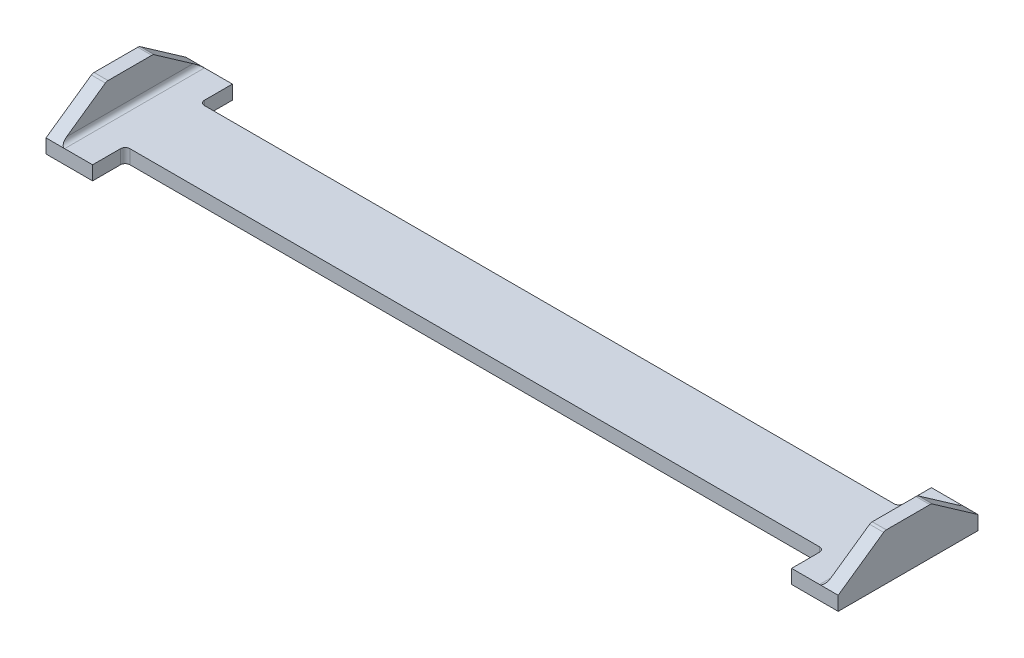
ISO-10303-21;
HEADER;
FILE_DESCRIPTION(('STEP AP214'),'2;1');
FILE_NAME('part.step','',(''),(''),'','','');
FILE_SCHEMA(('AUTOMOTIVE_DESIGN { 1 0 10303 214 1 1 1 1 }'));
ENDSEC;
DATA;
#1=APPLICATION_CONTEXT('core data for automotive mechanical design processes');
#2=APPLICATION_PROTOCOL_DEFINITION('international standard','automotive_design',2000,#1);
#3=PRODUCT_CONTEXT('',#1,'mechanical');
#4=PRODUCT('Part','Part','',(#3));
#5=PRODUCT_RELATED_PRODUCT_CATEGORY('part','',(#4));
#6=PRODUCT_DEFINITION_FORMATION('','',#4);
#7=PRODUCT_DEFINITION_CONTEXT('part definition',#1,'design');
#8=PRODUCT_DEFINITION('design','',#6,#7);
#9=PRODUCT_DEFINITION_SHAPE('','',#8);
#10=(LENGTH_UNIT() NAMED_UNIT(*) SI_UNIT(.MILLI.,.METRE.));
#11=(NAMED_UNIT(*) PLANE_ANGLE_UNIT() SI_UNIT($,.RADIAN.));
#12=(NAMED_UNIT(*) SI_UNIT($,.STERADIAN.) SOLID_ANGLE_UNIT());
#13=UNCERTAINTY_MEASURE_WITH_UNIT(LENGTH_MEASURE(1.E-05),#10,'distance_accuracy_value','');
#14=(GEOMETRIC_REPRESENTATION_CONTEXT(3) GLOBAL_UNCERTAINTY_ASSIGNED_CONTEXT((#13)) GLOBAL_UNIT_ASSIGNED_CONTEXT((#10,
#11,#12)) REPRESENTATION_CONTEXT('',''));
#15=CARTESIAN_POINT('',(0.,0.,0.));
#16=DIRECTION('',(0.,0.,1.));
#17=DIRECTION('',(1.,0.,0.));
#18=AXIS2_PLACEMENT_3D('',#15,#16,#17);
#19=CARTESIAN_POINT('',(0.,3.81,0.));
#20=DIRECTION('',(0.,1.,0.));
#21=DIRECTION('',(0.,0.,1.));
#22=AXIS2_PLACEMENT_3D('',#19,#20,#21);
#23=PLANE('',#22);
#24=DIRECTION('',(1.,0.,0.));
#25=VECTOR('',#24,1.);
#26=CARTESIAN_POINT('',(95.25,3.81,19.05));
#27=LINE('',#26,#25);
#28=CARTESIAN_POINT('',(95.25,3.81,19.05));
#29=VERTEX_POINT('',#28);
#30=CARTESIAN_POINT('',(102.87,3.81,19.05));
#31=VERTEX_POINT('',#30);
#32=EDGE_CURVE('E301',#29,#31,#27,.T.);
#33=ORIENTED_EDGE('',*,*,#32,.T.);
#34=DIRECTION('',(0.,0.,-1.));
#35=VECTOR('',#34,1.);
#36=CARTESIAN_POINT('',(102.87,3.81,0.));
#37=LINE('',#36,#35);
#38=CARTESIAN_POINT('',(102.87,3.81,-19.05));
#39=VERTEX_POINT('',#38);
#40=EDGE_CURVE('E438',#31,#39,#37,.T.);
#41=ORIENTED_EDGE('',*,*,#40,.T.);
#42=DIRECTION('',(-1.,0.,0.));
#43=VECTOR('',#42,1.);
#44=CARTESIAN_POINT('',(95.25,3.81,-19.05));
#45=LINE('',#44,#43);
#46=CARTESIAN_POINT('',(95.25,3.81,-19.05));
#47=VERTEX_POINT('',#46);
#48=EDGE_CURVE('E305',#39,#47,#45,.T.);
#49=ORIENTED_EDGE('',*,*,#48,.T.);
#50=DIRECTION('',(0.,0.,1.));
#51=VECTOR('',#50,1.);
#52=CARTESIAN_POINT('',(95.25,3.81,-10.16));
#53=LINE('',#52,#51);
#54=CARTESIAN_POINT('',(95.25,3.81,-11.43));
#55=VERTEX_POINT('',#54);
#56=EDGE_CURVE('E309',#47,#55,#53,.T.);
#57=ORIENTED_EDGE('',*,*,#56,.T.);
#58=CARTESIAN_POINT('',(93.98,3.81,-11.43));
#59=DIRECTION('',(0.,1.,0.));
#60=DIRECTION('',(0.,0.,1.));
#61=AXIS2_PLACEMENT_3D('',#58,#59,#60);
#62=CIRCLE('',#61,1.27);
#63=CARTESIAN_POINT('',(93.98,3.81,-10.16));
#64=VERTEX_POINT('',#63);
#65=EDGE_CURVE('E486',#55,#64,#62,.F.);
#66=ORIENTED_EDGE('',*,*,#65,.T.);
#67=DIRECTION('',(-1.,0.,0.));
#68=VECTOR('',#67,1.);
#69=CARTESIAN_POINT('',(95.25,3.81,-10.16));
#70=LINE('',#69,#68);
#71=CARTESIAN_POINT('',(-93.98,3.81,-10.16));
#72=VERTEX_POINT('',#71);
#73=EDGE_CURVE('E313',#64,#72,#70,.T.);
#74=ORIENTED_EDGE('',*,*,#73,.T.);
#75=CARTESIAN_POINT('',(-93.98,3.81,-11.43));
#76=DIRECTION('',(0.,1.,0.));
#77=DIRECTION('',(0.,0.,1.));
#78=AXIS2_PLACEMENT_3D('',#75,#76,#77);
#79=CIRCLE('',#78,1.27);
#80=CARTESIAN_POINT('',(-95.25,3.81,-11.43));
#81=VERTEX_POINT('',#80);
#82=EDGE_CURVE('E498',#72,#81,#79,.F.);
#83=ORIENTED_EDGE('',*,*,#82,.T.);
#84=DIRECTION('',(0.,0.,-1.));
#85=VECTOR('',#84,1.);
#86=CARTESIAN_POINT('',(-95.25,3.81,-10.16));
#87=LINE('',#86,#85);
#88=CARTESIAN_POINT('',(-95.25,3.81,-19.05));
#89=VERTEX_POINT('',#88);
#90=EDGE_CURVE('E284',#81,#89,#87,.T.);
#91=ORIENTED_EDGE('',*,*,#90,.T.);
#92=DIRECTION('',(-1.,0.,0.));
#93=VECTOR('',#92,1.);
#94=CARTESIAN_POINT('',(-95.25,3.81,-19.05));
#95=LINE('',#94,#93);
#96=CARTESIAN_POINT('',(-102.87,3.81,-19.05));
#97=VERTEX_POINT('',#96);
#98=EDGE_CURVE('E287',#89,#97,#95,.T.);
#99=ORIENTED_EDGE('',*,*,#98,.T.);
#100=DIRECTION('',(0.,0.,1.));
#101=VECTOR('',#100,1.);
#102=CARTESIAN_POINT('',(-102.87,3.81,0.));
#103=LINE('',#102,#101);
#104=CARTESIAN_POINT('',(-102.87,3.81,19.05));
#105=VERTEX_POINT('',#104);
#106=EDGE_CURVE('E434',#97,#105,#103,.T.);
#107=ORIENTED_EDGE('',*,*,#106,.T.);
#108=DIRECTION('',(1.,0.,0.));
#109=VECTOR('',#108,1.);
#110=CARTESIAN_POINT('',(-95.25,3.81,19.05));
#111=LINE('',#110,#109);
#112=CARTESIAN_POINT('',(-95.25,3.81,19.05));
#113=VERTEX_POINT('',#112);
#114=EDGE_CURVE('E237',#105,#113,#111,.T.);
#115=ORIENTED_EDGE('',*,*,#114,.T.);
#116=DIRECTION('',(0.,0.,-1.));
#117=VECTOR('',#116,1.);
#118=CARTESIAN_POINT('',(-95.25,3.81,10.16));
#119=LINE('',#118,#117);
#120=CARTESIAN_POINT('',(-95.25,3.81,11.43));
#121=VERTEX_POINT('',#120);
#122=EDGE_CURVE('E242',#113,#121,#119,.T.);
#123=ORIENTED_EDGE('',*,*,#122,.T.);
#124=CARTESIAN_POINT('',(-93.98,3.81,11.43));
#125=DIRECTION('',(0.,1.,0.));
#126=DIRECTION('',(0.,0.,1.));
#127=AXIS2_PLACEMENT_3D('',#124,#125,#126);
#128=CIRCLE('',#127,1.27);
#129=CARTESIAN_POINT('',(-93.98,3.81,10.16));
#130=VERTEX_POINT('',#129);
#131=EDGE_CURVE('E11',#121,#130,#128,.F.);
#132=ORIENTED_EDGE('',*,*,#131,.T.);
#133=DIRECTION('',(1.,0.,0.));
#134=VECTOR('',#133,1.);
#135=CARTESIAN_POINT('',(95.25,3.81,10.16));
#136=LINE('',#135,#134);
#137=CARTESIAN_POINT('',(93.98,3.81,10.16));
#138=VERTEX_POINT('',#137);
#139=EDGE_CURVE('E294',#130,#138,#136,.T.);
#140=ORIENTED_EDGE('',*,*,#139,.T.);
#141=CARTESIAN_POINT('',(93.98,3.81,11.43));
#142=DIRECTION('',(0.,1.,0.));
#143=DIRECTION('',(0.,0.,1.));
#144=AXIS2_PLACEMENT_3D('',#141,#142,#143);
#145=CIRCLE('',#144,1.27);
#146=CARTESIAN_POINT('',(95.25,3.81,11.43));
#147=VERTEX_POINT('',#146);
#148=EDGE_CURVE('E492',#138,#147,#145,.F.);
#149=ORIENTED_EDGE('',*,*,#148,.T.);
#150=DIRECTION('',(0.,0.,1.));
#151=VECTOR('',#150,1.);
#152=CARTESIAN_POINT('',(95.25,3.81,10.16));
#153=LINE('',#152,#151);
#154=EDGE_CURVE('E298',#147,#29,#153,.T.);
#155=ORIENTED_EDGE('',*,*,#154,.T.);
#156=EDGE_LOOP('',(#33,#41,#49,#57,#66,#74,#83,#91,#99,#107,#115,#123,#132,#140,#149,#155));
#157=FACE_BOUND('',#156,.T.);
#158=ADVANCED_FACE('F45',(#157),#23,.T.);
#159=CARTESIAN_POINT('',(-95.25,3.81,-10.16));
#160=DIRECTION('',(-1.,0.,0.));
#161=DIRECTION('',(0.,0.,1.));
#162=AXIS2_PLACEMENT_3D('',#159,#160,#161);
#163=PLANE('',#162);
#164=ORIENTED_EDGE('',*,*,#90,.F.);
#165=DIRECTION('',(0.,-1.,0.));
#166=VECTOR('',#165,1.);
#167=CARTESIAN_POINT('',(-95.25,0.,-11.43));
#168=LINE('',#167,#166);
#169=CARTESIAN_POINT('',(-95.25,0.,-11.43));
#170=VERTEX_POINT('',#169);
#171=EDGE_CURVE('E477',#81,#170,#168,.T.);
#172=ORIENTED_EDGE('',*,*,#171,.T.);
#173=DIRECTION('',(0.,0.,-1.));
#174=VECTOR('',#173,1.);
#175=CARTESIAN_POINT('',(-95.25,0.,-10.16));
#176=LINE('',#175,#174);
#177=CARTESIAN_POINT('',(-95.25,0.,-19.05));
#178=VERTEX_POINT('',#177);
#179=EDGE_CURVE('E283',#170,#178,#176,.T.);
#180=ORIENTED_EDGE('',*,*,#179,.T.);
#181=DIRECTION('',(0.,-1.,0.));
#182=VECTOR('',#181,1.);
#183=CARTESIAN_POINT('',(-95.25,3.81,-19.05));
#184=LINE('',#183,#182);
#185=EDGE_CURVE('E374',#89,#178,#184,.T.);
#186=ORIENTED_EDGE('',*,*,#185,.F.);
#187=EDGE_LOOP('',(#164,#172,#180,#186));
#188=FACE_BOUND('',#187,.T.);
#189=ADVANCED_FACE('F604',(#188),#163,.F.);
#190=CARTESIAN_POINT('',(-95.25,3.81,-19.05));
#191=DIRECTION('',(0.,0.,1.));
#192=DIRECTION('',(1.,0.,0.));
#193=AXIS2_PLACEMENT_3D('',#190,#191,#192);
#194=PLANE('',#193);
#195=DIRECTION('',(-1.,0.,0.));
#196=VECTOR('',#195,1.);
#197=CARTESIAN_POINT('',(-104.14,3.81,-19.05));
#198=LINE('',#197,#196);
#199=CARTESIAN_POINT('',(-107.95,3.81,-19.05));
#200=VERTEX_POINT('',#199);
#201=EDGE_CURVE('E279',#97,#200,#198,.T.);
#202=ORIENTED_EDGE('',*,*,#201,.F.);
#203=ORIENTED_EDGE('',*,*,#98,.F.);
#204=ORIENTED_EDGE('',*,*,#185,.T.);
#205=DIRECTION('',(-1.,0.,0.));
#206=VECTOR('',#205,1.);
#207=CARTESIAN_POINT('',(-95.25,0.,-19.05));
#208=LINE('',#207,#206);
#209=CARTESIAN_POINT('',(-107.95,0.,-19.05));
#210=VERTEX_POINT('',#209);
#211=EDGE_CURVE('E320',#178,#210,#208,.T.);
#212=ORIENTED_EDGE('',*,*,#211,.T.);
#213=DIRECTION('',(0.,-1.,0.));
#214=VECTOR('',#213,1.);
#215=CARTESIAN_POINT('',(-107.95,3.81,-19.05));
#216=LINE('',#215,#214);
#217=EDGE_CURVE('E253',#200,#210,#216,.T.);
#218=ORIENTED_EDGE('',*,*,#217,.F.);
#219=EDGE_LOOP('',(#202,#203,#204,#212,#218));
#220=FACE_BOUND('',#219,.T.);
#221=ADVANCED_FACE('F608',(#220),#194,.F.);
#222=CARTESIAN_POINT('',(-107.95,3.81,-19.05));
#223=DIRECTION('',(1.,0.,0.));
#224=DIRECTION('',(0.,0.,-1.));
#225=AXIS2_PLACEMENT_3D('',#222,#223,#224);
#226=PLANE('',#225);
#227=DIRECTION('',(0.,0.,-1.));
#228=VECTOR('',#227,1.);
#229=CARTESIAN_POINT('',(-107.95,12.7,-6.35));
#230=LINE('',#229,#228);
#231=CARTESIAN_POINT('',(-107.95,12.7,5.94966776685974));
#232=VERTEX_POINT('',#231);
#233=CARTESIAN_POINT('',(-107.95,12.7,-5.94966776685974));
#234=VERTEX_POINT('',#233);
#235=EDGE_CURVE('E262',#232,#234,#230,.T.);
#236=ORIENTED_EDGE('',*,*,#235,.T.);
#237=CARTESIAN_POINT('',(-107.95,11.43,-5.94966776685974));
#238=DIRECTION('',(1.,0.,0.));
#239=DIRECTION('',(0.,0.,-1.));
#240=AXIS2_PLACEMENT_3D('',#237,#238,#239);
#241=CIRCLE('',#240,1.27);
#242=CARTESIAN_POINT('',(-107.95,12.4704245390592,-6.67796494420117));
#243=VERTEX_POINT('',#242);
#244=EDGE_CURVE('E417',#234,#243,#241,.F.);
#245=ORIENTED_EDGE('',*,*,#244,.T.);
#246=DIRECTION('',(0.,-0.573462344363328,-0.81923192051904));
#247=VECTOR('',#246,1.);
#248=CARTESIAN_POINT('',(-107.95,3.81,-19.05));
#249=LINE('',#248,#247);
#250=EDGE_CURVE('E267',#243,#200,#249,.T.);
#251=ORIENTED_EDGE('',*,*,#250,.T.);
#252=ORIENTED_EDGE('',*,*,#217,.T.);
#253=DIRECTION('',(0.,0.,1.));
#254=VECTOR('',#253,1.);
#255=CARTESIAN_POINT('',(-107.95,0.,-19.05));
#256=LINE('',#255,#254);
#257=CARTESIAN_POINT('',(-107.95,0.,19.05));
#258=VERTEX_POINT('',#257);
#259=EDGE_CURVE('E251',#210,#258,#256,.T.);
#260=ORIENTED_EDGE('',*,*,#259,.T.);
#261=DIRECTION('',(0.,-1.,0.));
#262=VECTOR('',#261,1.);
#263=CARTESIAN_POINT('',(-107.95,3.81,19.05));
#264=LINE('',#263,#262);
#265=CARTESIAN_POINT('',(-107.95,3.81,19.05));
#266=VERTEX_POINT('',#265);
#267=EDGE_CURVE('E234',#266,#258,#264,.T.);
#268=ORIENTED_EDGE('',*,*,#267,.F.);
#269=DIRECTION('',(0.,0.573462344363328,-0.81923192051904));
#270=VECTOR('',#269,1.);
#271=CARTESIAN_POINT('',(-107.95,3.81,19.05));
#272=LINE('',#271,#270);
#273=CARTESIAN_POINT('',(-107.95,12.4704245390592,6.67796494420117));
#274=VERTEX_POINT('',#273);
#275=EDGE_CURVE('E248',#266,#274,#272,.T.);
#276=ORIENTED_EDGE('',*,*,#275,.T.);
#277=CARTESIAN_POINT('',(-107.95,11.43,5.94966776685974));
#278=DIRECTION('',(1.,0.,0.));
#279=DIRECTION('',(0.,0.,-1.));
#280=AXIS2_PLACEMENT_3D('',#277,#278,#279);
#281=CIRCLE('',#280,1.27);
#282=EDGE_CURVE('E414',#274,#232,#281,.F.);
#283=ORIENTED_EDGE('',*,*,#282,.T.);
#284=EDGE_LOOP('',(#236,#245,#251,#252,#260,#268,#276,#283));
#285=FACE_BOUND('',#284,.T.);
#286=ADVANCED_FACE('F247',(#285),#226,.F.);
#287=CARTESIAN_POINT('',(-95.25,3.81,19.05));
#288=DIRECTION('',(0.,0.,-1.));
#289=DIRECTION('',(-1.,0.,0.));
#290=AXIS2_PLACEMENT_3D('',#287,#288,#289);
#291=PLANE('',#290);
#292=DIRECTION('',(1.,0.,0.));
#293=VECTOR('',#292,1.);
#294=CARTESIAN_POINT('',(-95.25,0.,19.05));
#295=LINE('',#294,#293);
#296=CARTESIAN_POINT('',(-95.25,0.,19.05));
#297=VERTEX_POINT('',#296);
#298=EDGE_CURVE('E325',#258,#297,#295,.T.);
#299=ORIENTED_EDGE('',*,*,#298,.T.);
#300=DIRECTION('',(0.,-1.,0.));
#301=VECTOR('',#300,1.);
#302=CARTESIAN_POINT('',(-95.25,3.81,19.05));
#303=LINE('',#302,#301);
#304=EDGE_CURVE('E254',#113,#297,#303,.T.);
#305=ORIENTED_EDGE('',*,*,#304,.F.);
#306=ORIENTED_EDGE('',*,*,#114,.F.);
#307=EDGE_CURVE('E231',#266,#105,#111,.T.);
#308=ORIENTED_EDGE('',*,*,#307,.F.);
#309=ORIENTED_EDGE('',*,*,#267,.T.);
#310=EDGE_LOOP('',(#299,#305,#306,#308,#309));
#311=FACE_BOUND('',#310,.T.);
#312=ADVANCED_FACE('F233',(#311),#291,.F.);
#313=CARTESIAN_POINT('',(-95.25,3.81,10.16));
#314=DIRECTION('',(-1.,0.,0.));
#315=DIRECTION('',(0.,0.,1.));
#316=AXIS2_PLACEMENT_3D('',#313,#314,#315);
#317=PLANE('',#316);
#318=DIRECTION('',(0.,0.,-1.));
#319=VECTOR('',#318,1.);
#320=CARTESIAN_POINT('',(-95.25,0.,10.16));
#321=LINE('',#320,#319);
#322=CARTESIAN_POINT('',(-95.25,0.,11.43));
#323=VERTEX_POINT('',#322);
#324=EDGE_CURVE('E328',#297,#323,#321,.T.);
#325=ORIENTED_EDGE('',*,*,#324,.T.);
#326=DIRECTION('',(0.,-1.,0.));
#327=VECTOR('',#326,1.);
#328=CARTESIAN_POINT('',(-95.25,3.81,11.43));
#329=LINE('',#328,#327);
#330=EDGE_CURVE('E61',#323,#121,#329,.F.);
#331=ORIENTED_EDGE('',*,*,#330,.T.);
#332=ORIENTED_EDGE('',*,*,#122,.F.);
#333=ORIENTED_EDGE('',*,*,#304,.T.);
#334=EDGE_LOOP('',(#325,#331,#332,#333));
#335=FACE_BOUND('',#334,.T.);
#336=ADVANCED_FACE('F634',(#335),#317,.F.);
#337=CARTESIAN_POINT('',(95.25,3.81,10.16));
#338=DIRECTION('',(0.,0.,-1.));
#339=DIRECTION('',(-1.,0.,0.));
#340=AXIS2_PLACEMENT_3D('',#337,#338,#339);
#341=PLANE('',#340);
#342=DIRECTION('',(1.,0.,0.));
#343=VECTOR('',#342,1.);
#344=CARTESIAN_POINT('',(95.25,0.,10.16));
#345=LINE('',#344,#343);
#346=CARTESIAN_POINT('',(-93.98,0.,10.16));
#347=VERTEX_POINT('',#346);
#348=CARTESIAN_POINT('',(93.98,0.,10.16));
#349=VERTEX_POINT('',#348);
#350=EDGE_CURVE('E331',#347,#349,#345,.T.);
#351=ORIENTED_EDGE('',*,*,#350,.T.);
#352=DIRECTION('',(0.,-1.,0.));
#353=VECTOR('',#352,1.);
#354=CARTESIAN_POINT('',(93.98,3.81,10.16));
#355=LINE('',#354,#353);
#356=EDGE_CURVE('E474',#349,#138,#355,.F.);
#357=ORIENTED_EDGE('',*,*,#356,.T.);
#358=ORIENTED_EDGE('',*,*,#139,.F.);
#359=DIRECTION('',(0.,-1.,0.));
#360=VECTOR('',#359,1.);
#361=CARTESIAN_POINT('',(-93.98,0.,10.16));
#362=LINE('',#361,#360);
#363=EDGE_CURVE('E470',#130,#347,#362,.T.);
#364=ORIENTED_EDGE('',*,*,#363,.T.);
#365=EDGE_LOOP('',(#351,#357,#358,#364));
#366=FACE_BOUND('',#365,.T.);
#367=ADVANCED_FACE('F640',(#366),#341,.F.);
#368=CARTESIAN_POINT('',(95.25,3.81,10.16));
#369=DIRECTION('',(1.,0.,0.));
#370=DIRECTION('',(0.,0.,-1.));
#371=AXIS2_PLACEMENT_3D('',#368,#369,#370);
#372=PLANE('',#371);
#373=ORIENTED_EDGE('',*,*,#154,.F.);
#374=DIRECTION('',(0.,-1.,0.));
#375=VECTOR('',#374,1.);
#376=CARTESIAN_POINT('',(95.25,0.,11.43));
#377=LINE('',#376,#375);
#378=CARTESIAN_POINT('',(95.25,0.,11.43));
#379=VERTEX_POINT('',#378);
#380=EDGE_CURVE('E466',#147,#379,#377,.T.);
#381=ORIENTED_EDGE('',*,*,#380,.T.);
#382=DIRECTION('',(0.,0.,1.));
#383=VECTOR('',#382,1.);
#384=CARTESIAN_POINT('',(95.25,0.,10.16));
#385=LINE('',#384,#383);
#386=CARTESIAN_POINT('',(95.25,0.,19.05));
#387=VERTEX_POINT('',#386);
#388=EDGE_CURVE('E335',#379,#387,#385,.T.);
#389=ORIENTED_EDGE('',*,*,#388,.T.);
#390=DIRECTION('',(0.,-1.,0.));
#391=VECTOR('',#390,1.);
#392=CARTESIAN_POINT('',(95.25,3.81,19.05));
#393=LINE('',#392,#391);
#394=EDGE_CURVE('E365',#29,#387,#393,.T.);
#395=ORIENTED_EDGE('',*,*,#394,.F.);
#396=EDGE_LOOP('',(#373,#381,#389,#395));
#397=FACE_BOUND('',#396,.T.);
#398=ADVANCED_FACE('F647',(#397),#372,.F.);
#399=CARTESIAN_POINT('',(95.25,3.81,19.05));
#400=DIRECTION('',(0.,0.,-1.));
#401=DIRECTION('',(-1.,0.,0.));
#402=AXIS2_PLACEMENT_3D('',#399,#400,#401);
#403=PLANE('',#402);
#404=DIRECTION('',(1.,0.,0.));
#405=VECTOR('',#404,1.);
#406=CARTESIAN_POINT('',(104.14,3.81,19.05));
#407=LINE('',#406,#405);
#408=CARTESIAN_POINT('',(107.95,3.81,19.05));
#409=VERTEX_POINT('',#408);
#410=EDGE_CURVE('E263',#31,#409,#407,.T.);
#411=ORIENTED_EDGE('',*,*,#410,.F.);
#412=ORIENTED_EDGE('',*,*,#32,.F.);
#413=ORIENTED_EDGE('',*,*,#394,.T.);
#414=DIRECTION('',(1.,0.,0.));
#415=VECTOR('',#414,1.);
#416=CARTESIAN_POINT('',(95.25,0.,19.05));
#417=LINE('',#416,#415);
#418=CARTESIAN_POINT('',(107.95,0.,19.05));
#419=VERTEX_POINT('',#418);
#420=EDGE_CURVE('E338',#387,#419,#417,.T.);
#421=ORIENTED_EDGE('',*,*,#420,.T.);
#422=DIRECTION('',(0.,-1.,0.));
#423=VECTOR('',#422,1.);
#424=CARTESIAN_POINT('',(107.95,3.81,19.05));
#425=LINE('',#424,#423);
#426=EDGE_CURVE('E361',#409,#419,#425,.T.);
#427=ORIENTED_EDGE('',*,*,#426,.F.);
#428=EDGE_LOOP('',(#411,#412,#413,#421,#427));
#429=FACE_BOUND('',#428,.T.);
#430=ADVANCED_FACE('F580',(#429),#403,.F.);
#431=CARTESIAN_POINT('',(107.95,3.81,-19.05));
#432=DIRECTION('',(-1.,0.,0.));
#433=DIRECTION('',(0.,0.,1.));
#434=AXIS2_PLACEMENT_3D('',#431,#432,#433);
#435=PLANE('',#434);
#436=DIRECTION('',(0.,-0.573462344363328,-0.81923192051904));
#437=VECTOR('',#436,1.);
#438=CARTESIAN_POINT('',(107.95,3.81,-19.05));
#439=LINE('',#438,#437);
#440=CARTESIAN_POINT('',(107.95,12.4704245390592,-6.67796494420117));
#441=VERTEX_POINT('',#440);
#442=CARTESIAN_POINT('',(107.95,3.81,-19.05));
#443=VERTEX_POINT('',#442);
#444=EDGE_CURVE('E521',#441,#443,#439,.T.);
#445=ORIENTED_EDGE('',*,*,#444,.F.);
#446=CARTESIAN_POINT('',(107.95,11.43,-5.94966776685974));
#447=DIRECTION('',(-1.,0.,0.));
#448=DIRECTION('',(0.,0.,1.));
#449=AXIS2_PLACEMENT_3D('',#446,#447,#448);
#450=CIRCLE('',#449,1.27);
#451=CARTESIAN_POINT('',(107.95,12.7,-5.94966776685974));
#452=VERTEX_POINT('',#451);
#453=EDGE_CURVE('E385',#441,#452,#450,.F.);
#454=ORIENTED_EDGE('',*,*,#453,.T.);
#455=DIRECTION('',(0.,0.,-1.));
#456=VECTOR('',#455,1.);
#457=CARTESIAN_POINT('',(107.95,12.7,-6.35));
#458=LINE('',#457,#456);
#459=CARTESIAN_POINT('',(107.95,12.7,5.94966776685974));
#460=VERTEX_POINT('',#459);
#461=EDGE_CURVE('E517',#460,#452,#458,.T.);
#462=ORIENTED_EDGE('',*,*,#461,.F.);
#463=CARTESIAN_POINT('',(107.95,11.43,5.94966776685974));
#464=DIRECTION('',(-1.,0.,0.));
#465=DIRECTION('',(0.,0.,1.));
#466=AXIS2_PLACEMENT_3D('',#463,#464,#465);
#467=CIRCLE('',#466,1.27);
#468=CARTESIAN_POINT('',(107.95,12.4704245390592,6.67796494420117));
#469=VERTEX_POINT('',#468);
#470=EDGE_CURVE('E382',#460,#469,#467,.F.);
#471=ORIENTED_EDGE('',*,*,#470,.T.);
#472=DIRECTION('',(0.,0.573462344363328,-0.81923192051904));
#473=VECTOR('',#472,1.);
#474=CARTESIAN_POINT('',(107.95,3.81,19.05));
#475=LINE('',#474,#473);
#476=EDGE_CURVE('E512',#409,#469,#475,.T.);
#477=ORIENTED_EDGE('',*,*,#476,.F.);
#478=ORIENTED_EDGE('',*,*,#426,.T.);
#479=DIRECTION('',(0.,0.,-1.));
#480=VECTOR('',#479,1.);
#481=CARTESIAN_POINT('',(107.95,0.,-19.05));
#482=LINE('',#481,#480);
#483=CARTESIAN_POINT('',(107.95,0.,-19.05));
#484=VERTEX_POINT('',#483);
#485=EDGE_CURVE('E341',#419,#484,#482,.T.);
#486=ORIENTED_EDGE('',*,*,#485,.T.);
#487=DIRECTION('',(0.,-1.,0.));
#488=VECTOR('',#487,1.);
#489=CARTESIAN_POINT('',(107.95,3.81,-19.05));
#490=LINE('',#489,#488);
#491=EDGE_CURVE('E357',#443,#484,#490,.T.);
#492=ORIENTED_EDGE('',*,*,#491,.F.);
#493=EDGE_LOOP('',(#445,#454,#462,#471,#477,#478,#486,#492));
#494=FACE_BOUND('',#493,.T.);
#495=ADVANCED_FACE('F561',(#494),#435,.F.);
#496=CARTESIAN_POINT('',(95.25,3.81,-19.05));
#497=DIRECTION('',(0.,0.,1.));
#498=DIRECTION('',(1.,0.,0.));
#499=AXIS2_PLACEMENT_3D('',#496,#497,#498);
#500=PLANE('',#499);
#501=DIRECTION('',(-1.,0.,0.));
#502=VECTOR('',#501,1.);
#503=CARTESIAN_POINT('',(95.25,0.,-19.05));
#504=LINE('',#503,#502);
#505=CARTESIAN_POINT('',(95.25,0.,-19.05));
#506=VERTEX_POINT('',#505);
#507=EDGE_CURVE('E344',#484,#506,#504,.T.);
#508=ORIENTED_EDGE('',*,*,#507,.T.);
#509=DIRECTION('',(0.,-1.,0.));
#510=VECTOR('',#509,1.);
#511=CARTESIAN_POINT('',(95.25,3.81,-19.05));
#512=LINE('',#511,#510);
#513=EDGE_CURVE('E317',#47,#506,#512,.T.);
#514=ORIENTED_EDGE('',*,*,#513,.F.);
#515=ORIENTED_EDGE('',*,*,#48,.F.);
#516=EDGE_CURVE('E306',#443,#39,#45,.T.);
#517=ORIENTED_EDGE('',*,*,#516,.F.);
#518=ORIENTED_EDGE('',*,*,#491,.T.);
#519=EDGE_LOOP('',(#508,#514,#515,#517,#518));
#520=FACE_BOUND('',#519,.T.);
#521=ADVANCED_FACE('F571',(#520),#500,.F.);
#522=CARTESIAN_POINT('',(95.25,3.81,-10.16));
#523=DIRECTION('',(1.,0.,0.));
#524=DIRECTION('',(0.,0.,-1.));
#525=AXIS2_PLACEMENT_3D('',#522,#523,#524);
#526=PLANE('',#525);
#527=DIRECTION('',(0.,0.,1.));
#528=VECTOR('',#527,1.);
#529=CARTESIAN_POINT('',(95.25,0.,-10.16));
#530=LINE('',#529,#528);
#531=CARTESIAN_POINT('',(95.25,0.,-11.43));
#532=VERTEX_POINT('',#531);
#533=EDGE_CURVE('E347',#506,#532,#530,.T.);
#534=ORIENTED_EDGE('',*,*,#533,.T.);
#535=DIRECTION('',(0.,-1.,0.));
#536=VECTOR('',#535,1.);
#537=CARTESIAN_POINT('',(95.25,3.81,-11.43));
#538=LINE('',#537,#536);
#539=EDGE_CURVE('E463',#532,#55,#538,.F.);
#540=ORIENTED_EDGE('',*,*,#539,.T.);
#541=ORIENTED_EDGE('',*,*,#56,.F.);
#542=ORIENTED_EDGE('',*,*,#513,.T.);
#543=EDGE_LOOP('',(#534,#540,#541,#542));
#544=FACE_BOUND('',#543,.T.);
#545=ADVANCED_FACE('F586',(#544),#526,.F.);
#546=CARTESIAN_POINT('',(95.25,3.81,-10.16));
#547=DIRECTION('',(0.,0.,1.));
#548=DIRECTION('',(1.,0.,0.));
#549=AXIS2_PLACEMENT_3D('',#546,#547,#548);
#550=PLANE('',#549);
#551=ORIENTED_EDGE('',*,*,#73,.F.);
#552=DIRECTION('',(0.,-1.,0.));
#553=VECTOR('',#552,1.);
#554=CARTESIAN_POINT('',(93.98,0.,-10.16));
#555=LINE('',#554,#553);
#556=CARTESIAN_POINT('',(93.98,0.,-10.16));
#557=VERTEX_POINT('',#556);
#558=EDGE_CURVE('E459',#64,#557,#555,.T.);
#559=ORIENTED_EDGE('',*,*,#558,.T.);
#560=DIRECTION('',(-1.,0.,0.));
#561=VECTOR('',#560,1.);
#562=CARTESIAN_POINT('',(95.25,0.,-10.16));
#563=LINE('',#562,#561);
#564=CARTESIAN_POINT('',(-93.98,0.,-10.16));
#565=VERTEX_POINT('',#564);
#566=EDGE_CURVE('E288',#557,#565,#563,.T.);
#567=ORIENTED_EDGE('',*,*,#566,.T.);
#568=DIRECTION('',(0.,-1.,0.));
#569=VECTOR('',#568,1.);
#570=CARTESIAN_POINT('',(-93.98,3.81,-10.16));
#571=LINE('',#570,#569);
#572=EDGE_CURVE('E456',#565,#72,#571,.F.);
#573=ORIENTED_EDGE('',*,*,#572,.T.);
#574=EDGE_LOOP('',(#551,#559,#567,#573));
#575=FACE_BOUND('',#574,.T.);
#576=ADVANCED_FACE('F594',(#575),#550,.F.);
#577=CARTESIAN_POINT('',(0.,0.,0.));
#578=DIRECTION('',(0.,1.,0.));
#579=DIRECTION('',(0.,0.,1.));
#580=AXIS2_PLACEMENT_3D('',#577,#578,#579);
#581=PLANE('',#580);
#582=ORIENTED_EDGE('',*,*,#485,.F.);
#583=ORIENTED_EDGE('',*,*,#420,.F.);
#584=ORIENTED_EDGE('',*,*,#388,.F.);
#585=CARTESIAN_POINT('',(93.98,0.,11.43));
#586=DIRECTION('',(0.,1.,0.));
#587=DIRECTION('',(0.,0.,1.));
#588=AXIS2_PLACEMENT_3D('',#585,#586,#587);
#589=CIRCLE('',#588,1.27);
#590=EDGE_CURVE('E489',#379,#349,#589,.T.);
#591=ORIENTED_EDGE('',*,*,#590,.T.);
#592=ORIENTED_EDGE('',*,*,#350,.F.);
#593=CARTESIAN_POINT('',(-93.98,0.,11.43));
#594=DIRECTION('',(0.,1.,0.));
#595=DIRECTION('',(0.,0.,1.));
#596=AXIS2_PLACEMENT_3D('',#593,#594,#595);
#597=CIRCLE('',#596,1.27);
#598=EDGE_CURVE('E54',#347,#323,#597,.T.);
#599=ORIENTED_EDGE('',*,*,#598,.T.);
#600=ORIENTED_EDGE('',*,*,#324,.F.);
#601=ORIENTED_EDGE('',*,*,#298,.F.);
#602=ORIENTED_EDGE('',*,*,#259,.F.);
#603=ORIENTED_EDGE('',*,*,#211,.F.);
#604=ORIENTED_EDGE('',*,*,#179,.F.);
#605=CARTESIAN_POINT('',(-93.98,0.,-11.43));
#606=DIRECTION('',(0.,1.,0.));
#607=DIRECTION('',(0.,0.,1.));
#608=AXIS2_PLACEMENT_3D('',#605,#606,#607);
#609=CIRCLE('',#608,1.27);
#610=EDGE_CURVE('E495',#170,#565,#609,.T.);
#611=ORIENTED_EDGE('',*,*,#610,.T.);
#612=ORIENTED_EDGE('',*,*,#566,.F.);
#613=CARTESIAN_POINT('',(93.98,0.,-11.43));
#614=DIRECTION('',(0.,1.,0.));
#615=DIRECTION('',(0.,0.,1.));
#616=AXIS2_PLACEMENT_3D('',#613,#614,#615);
#617=CIRCLE('',#616,1.27);
#618=EDGE_CURVE('E483',#557,#532,#617,.T.);
#619=ORIENTED_EDGE('',*,*,#618,.T.);
#620=ORIENTED_EDGE('',*,*,#533,.F.);
#621=ORIENTED_EDGE('',*,*,#507,.F.);
#622=EDGE_LOOP('',(#582,#583,#584,#591,#592,#599,#600,#601,#602,#603,#604,#611,#612,#619,#620,#621));
#623=FACE_BOUND('',#622,.T.);
#624=ADVANCED_FACE('F582',(#623),#581,.F.);
#625=CARTESIAN_POINT('',(-104.14,3.81,-19.05));
#626=DIRECTION('',(0.,0.81923192051904,-0.573462344363328));
#627=DIRECTION('',(0.,0.573462344363328,0.819231920519041));
#628=AXIS2_PLACEMENT_3D('',#625,#626,#627);
#629=PLANE('',#628);
#630=ORIENTED_EDGE('',*,*,#250,.F.);
#631=DIRECTION('',(-1.,0.,0.));
#632=VECTOR('',#631,1.);
#633=CARTESIAN_POINT('',(-104.14,12.4704245390592,-6.67796494420117));
#634=LINE('',#633,#632);
#635=CARTESIAN_POINT('',(-104.14,12.4704245390592,-6.67796494420117));
#636=VERTEX_POINT('',#635);
#637=EDGE_CURVE('E420',#243,#636,#634,.F.);
#638=ORIENTED_EDGE('',*,*,#637,.T.);
#639=DIRECTION('',(0.,-0.573462344363328,-0.81923192051904));
#640=VECTOR('',#639,1.);
#641=CARTESIAN_POINT('',(-104.14,3.81,-19.05));
#642=LINE('',#641,#640);
#643=CARTESIAN_POINT('',(-104.14,5.08,-17.2357142857143));
#644=VERTEX_POINT('',#643);
#645=EDGE_CURVE('E273',#636,#644,#642,.T.);
#646=ORIENTED_EDGE('',*,*,#645,.T.);
#647=CARTESIAN_POINT('',(-102.87,5.08,-17.2357142857143));
#648=DIRECTION('',(0.,0.81923192051904,-0.573462344363328));
#649=DIRECTION('',(0.,0.573462344363328,0.819231920519041));
#650=AXIS2_PLACEMENT_3D('',#647,#648,#649);
#651=ELLIPSE('',#650,2.21461794742597,1.27);
#652=EDGE_CURVE('E452',#644,#97,#651,.F.);
#653=ORIENTED_EDGE('',*,*,#652,.T.);
#654=ORIENTED_EDGE('',*,*,#201,.T.);
#655=EDGE_LOOP('',(#630,#638,#646,#653,#654));
#656=FACE_BOUND('',#655,.T.);
#657=ADVANCED_FACE('F614',(#656),#629,.T.);
#658=CARTESIAN_POINT('',(-104.14,12.7,-6.35));
#659=DIRECTION('',(0.,1.,0.));
#660=DIRECTION('',(0.,0.,1.));
#661=AXIS2_PLACEMENT_3D('',#658,#659,#660);
#662=PLANE('',#661);
#663=DIRECTION('',(0.,0.,-1.));
#664=VECTOR('',#663,1.);
#665=CARTESIAN_POINT('',(-104.14,12.7,-6.35));
#666=LINE('',#665,#664);
#667=CARTESIAN_POINT('',(-104.14,12.7,5.94966776685974));
#668=VERTEX_POINT('',#667);
#669=CARTESIAN_POINT('',(-104.14,12.7,-5.94966776685974));
#670=VERTEX_POINT('',#669);
#671=EDGE_CURVE('E506',#668,#670,#666,.T.);
#672=ORIENTED_EDGE('',*,*,#671,.T.);
#673=DIRECTION('',(-1.,0.,0.));
#674=VECTOR('',#673,1.);
#675=CARTESIAN_POINT('',(-104.14,12.7,-5.94966776685974));
#676=LINE('',#675,#674);
#677=EDGE_CURVE('E410',#670,#234,#676,.T.);
#678=ORIENTED_EDGE('',*,*,#677,.T.);
#679=ORIENTED_EDGE('',*,*,#235,.F.);
#680=DIRECTION('',(-1.,0.,0.));
#681=VECTOR('',#680,1.);
#682=CARTESIAN_POINT('',(-104.14,12.7,5.94966776685974));
#683=LINE('',#682,#681);
#684=EDGE_CURVE('E407',#232,#668,#683,.F.);
#685=ORIENTED_EDGE('',*,*,#684,.T.);
#686=EDGE_LOOP('',(#672,#678,#679,#685));
#687=FACE_BOUND('',#686,.T.);
#688=ADVANCED_FACE('F628',(#687),#662,.T.);
#689=CARTESIAN_POINT('',(-104.14,3.81,19.05));
#690=DIRECTION('',(0.,0.81923192051904,0.573462344363328));
#691=DIRECTION('',(0.,-0.573462344363328,0.819231920519041));
#692=AXIS2_PLACEMENT_3D('',#689,#690,#691);
#693=PLANE('',#692);
#694=DIRECTION('',(0.,0.573462344363328,-0.81923192051904));
#695=VECTOR('',#694,1.);
#696=CARTESIAN_POINT('',(-104.14,3.81,19.05));
#697=LINE('',#696,#695);
#698=CARTESIAN_POINT('',(-104.14,5.08,17.2357142857143));
#699=VERTEX_POINT('',#698);
#700=CARTESIAN_POINT('',(-104.14,12.4704245390592,6.67796494420117));
#701=VERTEX_POINT('',#700);
#702=EDGE_CURVE('E278',#699,#701,#697,.T.);
#703=ORIENTED_EDGE('',*,*,#702,.T.);
#704=DIRECTION('',(-1.,0.,0.));
#705=VECTOR('',#704,1.);
#706=CARTESIAN_POINT('',(-104.14,12.4704245390592,6.67796494420117));
#707=LINE('',#706,#705);
#708=EDGE_CURVE('E260',#701,#274,#707,.T.);
#709=ORIENTED_EDGE('',*,*,#708,.T.);
#710=ORIENTED_EDGE('',*,*,#275,.F.);
#711=ORIENTED_EDGE('',*,*,#307,.T.);
#712=CARTESIAN_POINT('',(-102.87,5.08,17.2357142857143));
#713=DIRECTION('',(0.,0.81923192051904,0.573462344363328));
#714=DIRECTION('',(0.,-0.573462344363328,0.819231920519041));
#715=AXIS2_PLACEMENT_3D('',#712,#713,#714);
#716=ELLIPSE('',#715,2.21461794742597,1.27);
#717=EDGE_CURVE('E449',#105,#699,#716,.F.);
#718=ORIENTED_EDGE('',*,*,#717,.T.);
#719=EDGE_LOOP('',(#703,#709,#710,#711,#718));
#720=FACE_BOUND('',#719,.T.);
#721=ADVANCED_FACE('F258',(#720),#693,.T.);
#722=CARTESIAN_POINT('',(-104.14,0.,0.));
#723=DIRECTION('',(-1.,0.,0.));
#724=DIRECTION('',(0.,0.,1.));
#725=AXIS2_PLACEMENT_3D('',#722,#723,#724);
#726=PLANE('',#725);
#727=ORIENTED_EDGE('',*,*,#645,.F.);
#728=CARTESIAN_POINT('',(-104.14,11.43,-5.94966776685974));
#729=DIRECTION('',(-1.,0.,0.));
#730=DIRECTION('',(0.,0.,1.));
#731=AXIS2_PLACEMENT_3D('',#728,#729,#730);
#732=CIRCLE('',#731,1.27);
#733=EDGE_CURVE('E429',#636,#670,#732,.F.);
#734=ORIENTED_EDGE('',*,*,#733,.T.);
#735=ORIENTED_EDGE('',*,*,#671,.F.);
#736=CARTESIAN_POINT('',(-104.14,11.43,5.94966776685974));
#737=DIRECTION('',(-1.,0.,0.));
#738=DIRECTION('',(0.,0.,1.));
#739=AXIS2_PLACEMENT_3D('',#736,#737,#738);
#740=CIRCLE('',#739,1.27);
#741=EDGE_CURVE('E426',#668,#701,#740,.F.);
#742=ORIENTED_EDGE('',*,*,#741,.T.);
#743=ORIENTED_EDGE('',*,*,#702,.F.);
#744=DIRECTION('',(0.,0.,1.));
#745=VECTOR('',#744,1.);
#746=CARTESIAN_POINT('',(-104.14,5.08,0.));
#747=LINE('',#746,#745);
#748=EDGE_CURVE('E423',#699,#644,#747,.F.);
#749=ORIENTED_EDGE('',*,*,#748,.T.);
#750=EDGE_LOOP('',(#727,#734,#735,#742,#743,#749));
#751=FACE_BOUND('',#750,.T.);
#752=ADVANCED_FACE('F620',(#751),#726,.F.);
#753=CARTESIAN_POINT('',(104.14,3.81,19.05));
#754=DIRECTION('',(0.,-0.81923192051904,-0.573462344363328));
#755=DIRECTION('',(0.,0.573462344363328,-0.819231920519041));
#756=AXIS2_PLACEMENT_3D('',#753,#754,#755);
#757=PLANE('',#756);
#758=ORIENTED_EDGE('',*,*,#476,.T.);
#759=DIRECTION('',(1.,0.,0.));
#760=VECTOR('',#759,1.);
#761=CARTESIAN_POINT('',(104.14,12.4704245390592,6.67796494420117));
#762=LINE('',#761,#760);
#763=CARTESIAN_POINT('',(104.14,12.4704245390592,6.67796494420117));
#764=VERTEX_POINT('',#763);
#765=EDGE_CURVE('E404',#469,#764,#762,.F.);
#766=ORIENTED_EDGE('',*,*,#765,.T.);
#767=DIRECTION('',(0.,0.573462344363328,-0.81923192051904));
#768=VECTOR('',#767,1.);
#769=CARTESIAN_POINT('',(104.14,3.81,19.05));
#770=LINE('',#769,#768);
#771=CARTESIAN_POINT('',(104.14,5.08,17.2357142857143));
#772=VERTEX_POINT('',#771);
#773=EDGE_CURVE('E270',#772,#764,#770,.T.);
#774=ORIENTED_EDGE('',*,*,#773,.F.);
#775=CARTESIAN_POINT('',(102.87,5.08,17.2357142857143));
#776=DIRECTION('',(0.,-0.81923192051904,-0.573462344363328));
#777=DIRECTION('',(0.,0.573462344363328,-0.819231920519041));
#778=AXIS2_PLACEMENT_3D('',#775,#776,#777);
#779=ELLIPSE('',#778,2.21461794742597,1.27);
#780=EDGE_CURVE('E445',#772,#31,#779,.T.);
#781=ORIENTED_EDGE('',*,*,#780,.T.);
#782=ORIENTED_EDGE('',*,*,#410,.T.);
#783=EDGE_LOOP('',(#758,#766,#774,#781,#782));
#784=FACE_BOUND('',#783,.T.);
#785=ADVANCED_FACE('F547',(#784),#757,.F.);
#786=CARTESIAN_POINT('',(104.14,12.7,-6.35));
#787=DIRECTION('',(0.,-1.,0.));
#788=DIRECTION('',(0.,0.,-1.));
#789=AXIS2_PLACEMENT_3D('',#786,#787,#788);
#790=PLANE('',#789);
#791=ORIENTED_EDGE('',*,*,#461,.T.);
#792=DIRECTION('',(1.,0.,0.));
#793=VECTOR('',#792,1.);
#794=CARTESIAN_POINT('',(104.14,12.7,-5.94966776685974));
#795=LINE('',#794,#793);
#796=CARTESIAN_POINT('',(104.14,12.7,-5.94966776685974));
#797=VERTEX_POINT('',#796);
#798=EDGE_CURVE('E392',#452,#797,#795,.F.);
#799=ORIENTED_EDGE('',*,*,#798,.T.);
#800=DIRECTION('',(0.,0.,-1.));
#801=VECTOR('',#800,1.);
#802=CARTESIAN_POINT('',(104.14,12.7,-6.35));
#803=LINE('',#802,#801);
#804=CARTESIAN_POINT('',(104.14,12.7,5.94966776685974));
#805=VERTEX_POINT('',#804);
#806=EDGE_CURVE('E527',#805,#797,#803,.T.);
#807=ORIENTED_EDGE('',*,*,#806,.F.);
#808=DIRECTION('',(1.,0.,0.));
#809=VECTOR('',#808,1.);
#810=CARTESIAN_POINT('',(104.14,12.7,5.94966776685974));
#811=LINE('',#810,#809);
#812=EDGE_CURVE('E388',#805,#460,#811,.T.);
#813=ORIENTED_EDGE('',*,*,#812,.T.);
#814=EDGE_LOOP('',(#791,#799,#807,#813));
#815=FACE_BOUND('',#814,.T.);
#816=ADVANCED_FACE('F557',(#815),#790,.F.);
#817=CARTESIAN_POINT('',(104.14,3.81,-19.05));
#818=DIRECTION('',(0.,-0.81923192051904,0.573462344363328));
#819=DIRECTION('',(0.,-0.573462344363328,-0.819231920519041));
#820=AXIS2_PLACEMENT_3D('',#817,#818,#819);
#821=PLANE('',#820);
#822=DIRECTION('',(0.,-0.573462344363328,-0.81923192051904));
#823=VECTOR('',#822,1.);
#824=CARTESIAN_POINT('',(104.14,3.81,-19.05));
#825=LINE('',#824,#823);
#826=CARTESIAN_POINT('',(104.14,12.4704245390592,-6.67796494420117));
#827=VERTEX_POINT('',#826);
#828=CARTESIAN_POINT('',(104.14,5.08,-17.2357142857143));
#829=VERTEX_POINT('',#828);
#830=EDGE_CURVE('E516',#827,#829,#825,.T.);
#831=ORIENTED_EDGE('',*,*,#830,.F.);
#832=DIRECTION('',(1.,0.,0.));
#833=VECTOR('',#832,1.);
#834=CARTESIAN_POINT('',(104.14,12.4704245390592,-6.67796494420117));
#835=LINE('',#834,#833);
#836=EDGE_CURVE('E378',#827,#441,#835,.T.);
#837=ORIENTED_EDGE('',*,*,#836,.T.);
#838=ORIENTED_EDGE('',*,*,#444,.T.);
#839=ORIENTED_EDGE('',*,*,#516,.T.);
#840=CARTESIAN_POINT('',(102.87,5.08,-17.2357142857143));
#841=DIRECTION('',(0.,-0.81923192051904,0.573462344363328));
#842=DIRECTION('',(0.,-0.573462344363328,-0.819231920519041));
#843=AXIS2_PLACEMENT_3D('',#840,#841,#842);
#844=ELLIPSE('',#843,2.21461794742597,1.27);
#845=EDGE_CURVE('E442',#39,#829,#844,.T.);
#846=ORIENTED_EDGE('',*,*,#845,.T.);
#847=EDGE_LOOP('',(#831,#837,#838,#839,#846));
#848=FACE_BOUND('',#847,.T.);
#849=ADVANCED_FACE('F565',(#848),#821,.F.);
#850=CARTESIAN_POINT('',(104.14,0.,0.));
#851=DIRECTION('',(1.,0.,0.));
#852=DIRECTION('',(0.,0.,1.));
#853=AXIS2_PLACEMENT_3D('',#850,#851,#852);
#854=PLANE('',#853);
#855=ORIENTED_EDGE('',*,*,#806,.T.);
#856=CARTESIAN_POINT('',(104.14,11.43,-5.94966776685974));
#857=DIRECTION('',(1.,0.,0.));
#858=DIRECTION('',(0.,0.,-1.));
#859=AXIS2_PLACEMENT_3D('',#856,#857,#858);
#860=CIRCLE('',#859,1.27);
#861=EDGE_CURVE('E401',#797,#827,#860,.F.);
#862=ORIENTED_EDGE('',*,*,#861,.T.);
#863=ORIENTED_EDGE('',*,*,#830,.T.);
#864=DIRECTION('',(0.,0.,-1.));
#865=VECTOR('',#864,1.);
#866=CARTESIAN_POINT('',(104.14,5.08,0.));
#867=LINE('',#866,#865);
#868=EDGE_CURVE('E395',#829,#772,#867,.F.);
#869=ORIENTED_EDGE('',*,*,#868,.T.);
#870=ORIENTED_EDGE('',*,*,#773,.T.);
#871=CARTESIAN_POINT('',(104.14,11.43,5.94966776685974));
#872=DIRECTION('',(1.,0.,0.));
#873=DIRECTION('',(0.,0.,-1.));
#874=AXIS2_PLACEMENT_3D('',#871,#872,#873);
#875=CIRCLE('',#874,1.27);
#876=EDGE_CURVE('E398',#764,#805,#875,.F.);
#877=ORIENTED_EDGE('',*,*,#876,.T.);
#878=EDGE_LOOP('',(#855,#862,#863,#869,#870,#877));
#879=FACE_BOUND('',#878,.T.);
#880=ADVANCED_FACE('F536',(#879),#854,.F.);
#881=CARTESIAN_POINT('',(104.14,11.43,-5.94966776685974));
#882=DIRECTION('',(1.,0.,0.));
#883=DIRECTION('',(0.,0.,-1.));
#884=AXIS2_PLACEMENT_3D('',#881,#882,#883);
#885=CYLINDRICAL_SURFACE('',#884,1.27);
#886=ORIENTED_EDGE('',*,*,#861,.F.);
#887=ORIENTED_EDGE('',*,*,#798,.F.);
#888=ORIENTED_EDGE('',*,*,#453,.F.);
#889=ORIENTED_EDGE('',*,*,#836,.F.);
#890=EDGE_LOOP('',(#886,#887,#888,#889));
#891=FACE_BOUND('',#890,.T.);
#892=ADVANCED_FACE('F564',(#891),#885,.T.);
#893=CARTESIAN_POINT('',(104.14,11.43,5.94966776685974));
#894=DIRECTION('',(1.,0.,0.));
#895=DIRECTION('',(0.,0.,-1.));
#896=AXIS2_PLACEMENT_3D('',#893,#894,#895);
#897=CYLINDRICAL_SURFACE('',#896,1.27);
#898=ORIENTED_EDGE('',*,*,#876,.F.);
#899=ORIENTED_EDGE('',*,*,#765,.F.);
#900=ORIENTED_EDGE('',*,*,#470,.F.);
#901=ORIENTED_EDGE('',*,*,#812,.F.);
#902=EDGE_LOOP('',(#898,#899,#900,#901));
#903=FACE_BOUND('',#902,.T.);
#904=ADVANCED_FACE('F554',(#903),#897,.T.);
#905=CARTESIAN_POINT('',(-104.14,11.43,-5.94966776685974));
#906=DIRECTION('',(-1.,0.,0.));
#907=DIRECTION('',(0.,0.,1.));
#908=AXIS2_PLACEMENT_3D('',#905,#906,#907);
#909=CYLINDRICAL_SURFACE('',#908,1.27);
#910=ORIENTED_EDGE('',*,*,#733,.F.);
#911=ORIENTED_EDGE('',*,*,#637,.F.);
#912=ORIENTED_EDGE('',*,*,#244,.F.);
#913=ORIENTED_EDGE('',*,*,#677,.F.);
#914=EDGE_LOOP('',(#910,#911,#912,#913));
#915=FACE_BOUND('',#914,.T.);
#916=ADVANCED_FACE('F632',(#915),#909,.T.);
#917=CARTESIAN_POINT('',(-104.14,11.43,5.94966776685974));
#918=DIRECTION('',(-1.,0.,0.));
#919=DIRECTION('',(0.,0.,1.));
#920=AXIS2_PLACEMENT_3D('',#917,#918,#919);
#921=CYLINDRICAL_SURFACE('',#920,1.27);
#922=ORIENTED_EDGE('',*,*,#741,.F.);
#923=ORIENTED_EDGE('',*,*,#684,.F.);
#924=ORIENTED_EDGE('',*,*,#282,.F.);
#925=ORIENTED_EDGE('',*,*,#708,.F.);
#926=EDGE_LOOP('',(#922,#923,#924,#925));
#927=FACE_BOUND('',#926,.T.);
#928=ADVANCED_FACE('F625',(#927),#921,.T.);
#929=CARTESIAN_POINT('',(102.87,5.08,0.));
#930=DIRECTION('',(0.,0.,-1.));
#931=DIRECTION('',(-1.,0.,0.));
#932=AXIS2_PLACEMENT_3D('',#929,#930,#931);
#933=CYLINDRICAL_SURFACE('',#932,1.27);
#934=ORIENTED_EDGE('',*,*,#780,.F.);
#935=ORIENTED_EDGE('',*,*,#868,.F.);
#936=ORIENTED_EDGE('',*,*,#845,.F.);
#937=ORIENTED_EDGE('',*,*,#40,.F.);
#938=EDGE_LOOP('',(#934,#935,#936,#937));
#939=FACE_BOUND('',#938,.T.);
#940=ADVANCED_FACE('F544',(#939),#933,.F.);
#941=CARTESIAN_POINT('',(-102.87,5.08,0.));
#942=DIRECTION('',(0.,0.,1.));
#943=DIRECTION('',(1.,0.,0.));
#944=AXIS2_PLACEMENT_3D('',#941,#942,#943);
#945=CYLINDRICAL_SURFACE('',#944,1.27);
#946=ORIENTED_EDGE('',*,*,#652,.F.);
#947=ORIENTED_EDGE('',*,*,#748,.F.);
#948=ORIENTED_EDGE('',*,*,#717,.F.);
#949=ORIENTED_EDGE('',*,*,#106,.F.);
#950=EDGE_LOOP('',(#946,#947,#948,#949));
#951=FACE_BOUND('',#950,.T.);
#952=ADVANCED_FACE('F618',(#951),#945,.F.);
#953=CARTESIAN_POINT('',(93.98,3.81,-11.43));
#954=DIRECTION('',(0.,1.,0.));
#955=DIRECTION('',(0.,0.,1.));
#956=AXIS2_PLACEMENT_3D('',#953,#954,#955);
#957=CYLINDRICAL_SURFACE('',#956,1.27);
#958=ORIENTED_EDGE('',*,*,#65,.F.);
#959=ORIENTED_EDGE('',*,*,#539,.F.);
#960=ORIENTED_EDGE('',*,*,#618,.F.);
#961=ORIENTED_EDGE('',*,*,#558,.F.);
#962=EDGE_LOOP('',(#958,#959,#960,#961));
#963=FACE_BOUND('',#962,.T.);
#964=ADVANCED_FACE('F589',(#963),#957,.F.);
#965=CARTESIAN_POINT('',(93.98,3.81,11.43));
#966=DIRECTION('',(0.,1.,0.));
#967=DIRECTION('',(0.,0.,1.));
#968=AXIS2_PLACEMENT_3D('',#965,#966,#967);
#969=CYLINDRICAL_SURFACE('',#968,1.27);
#970=ORIENTED_EDGE('',*,*,#148,.F.);
#971=ORIENTED_EDGE('',*,*,#356,.F.);
#972=ORIENTED_EDGE('',*,*,#590,.F.);
#973=ORIENTED_EDGE('',*,*,#380,.F.);
#974=EDGE_LOOP('',(#970,#971,#972,#973));
#975=FACE_BOUND('',#974,.T.);
#976=ADVANCED_FACE('F645',(#975),#969,.F.);
#977=CARTESIAN_POINT('',(-93.98,3.81,-11.43));
#978=DIRECTION('',(0.,1.,0.));
#979=DIRECTION('',(0.,0.,1.));
#980=AXIS2_PLACEMENT_3D('',#977,#978,#979);
#981=CYLINDRICAL_SURFACE('',#980,1.27);
#982=ORIENTED_EDGE('',*,*,#82,.F.);
#983=ORIENTED_EDGE('',*,*,#572,.F.);
#984=ORIENTED_EDGE('',*,*,#610,.F.);
#985=ORIENTED_EDGE('',*,*,#171,.F.);
#986=EDGE_LOOP('',(#982,#983,#984,#985));
#987=FACE_BOUND('',#986,.T.);
#988=ADVANCED_FACE('F598',(#987),#981,.F.);
#989=CARTESIAN_POINT('',(-93.98,3.81,11.43));
#990=DIRECTION('',(0.,1.,0.));
#991=DIRECTION('',(0.,0.,1.));
#992=AXIS2_PLACEMENT_3D('',#989,#990,#991);
#993=CYLINDRICAL_SURFACE('',#992,1.27);
#994=ORIENTED_EDGE('',*,*,#131,.F.);
#995=ORIENTED_EDGE('',*,*,#330,.F.);
#996=ORIENTED_EDGE('',*,*,#598,.F.);
#997=ORIENTED_EDGE('',*,*,#363,.F.);
#998=EDGE_LOOP('',(#994,#995,#996,#997));
#999=FACE_BOUND('',#998,.T.);
#1000=ADVANCED_FACE('F47',(#999),#993,.F.);
#1001=CLOSED_SHELL('',(#158,#189,#221,#286,#312,#336,#367,#398,#430,#495,#521,#545,#576,#624,
#657,#688,#721,#752,#785,#816,#849,#880,#892,#904,#916,#928,#940,#952,#964,#976,#988,#1000));
#1002=MANIFOLD_SOLID_BREP('B2',#1001);
#1003=ADVANCED_BREP_SHAPE_REPRESENTATION('',(#18,#1002),#14);
#1004=SHAPE_DEFINITION_REPRESENTATION(#9,#1003);
ENDSEC;
END-ISO-10303-21;
